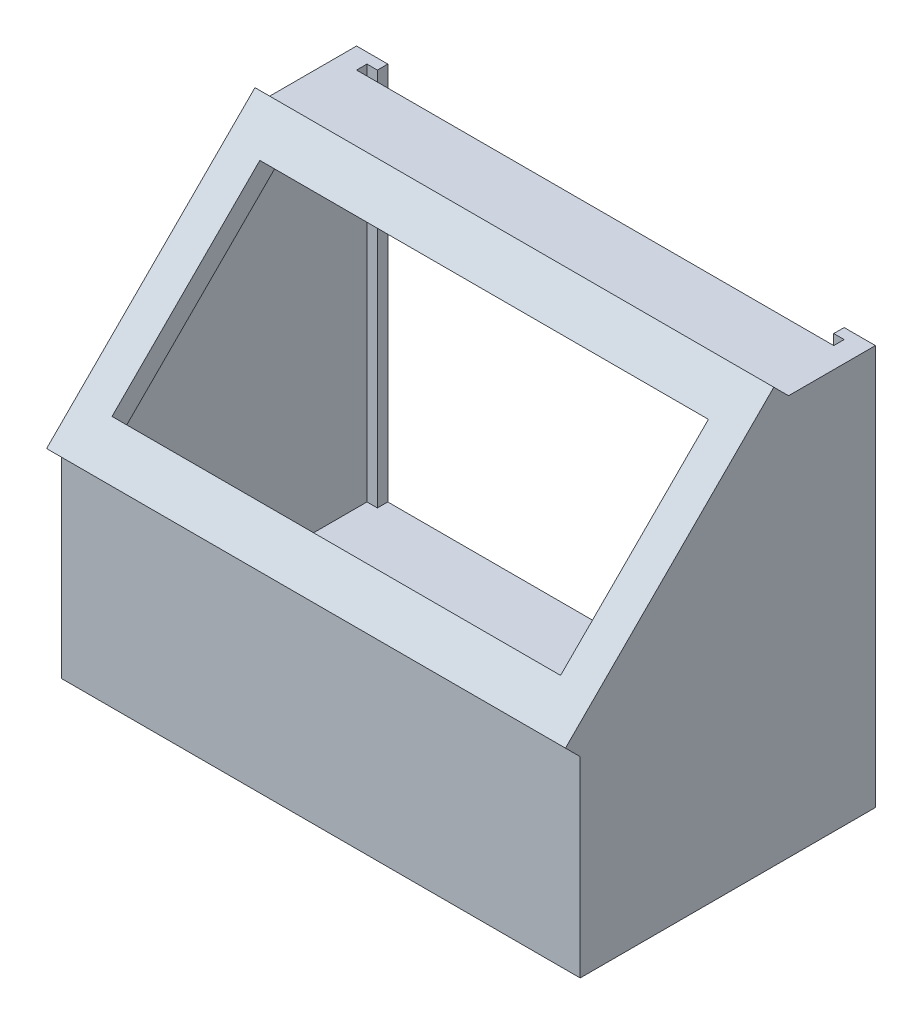
ISO-10303-21;
HEADER;
FILE_DESCRIPTION(('STEP AP214'),'2;1');
FILE_NAME('part.step','',(''),(''),'','','');
FILE_SCHEMA(('AUTOMOTIVE_DESIGN { 1 0 10303 214 1 1 1 1 }'));
ENDSEC;
DATA;
#1=APPLICATION_CONTEXT('core data for automotive mechanical design processes');
#2=APPLICATION_PROTOCOL_DEFINITION('international standard','automotive_design',2000,#1);
#3=PRODUCT_CONTEXT('',#1,'mechanical');
#4=PRODUCT('Part','Part','',(#3));
#5=PRODUCT_RELATED_PRODUCT_CATEGORY('part','',(#4));
#6=PRODUCT_DEFINITION_FORMATION('','',#4);
#7=PRODUCT_DEFINITION_CONTEXT('part definition',#1,'design');
#8=PRODUCT_DEFINITION('design','',#6,#7);
#9=PRODUCT_DEFINITION_SHAPE('','',#8);
#10=(LENGTH_UNIT() NAMED_UNIT(*) SI_UNIT(.MILLI.,.METRE.));
#11=(NAMED_UNIT(*) PLANE_ANGLE_UNIT() SI_UNIT($,.RADIAN.));
#12=(NAMED_UNIT(*) SI_UNIT($,.STERADIAN.) SOLID_ANGLE_UNIT());
#13=UNCERTAINTY_MEASURE_WITH_UNIT(LENGTH_MEASURE(1.E-05),#10,'distance_accuracy_value','');
#14=(GEOMETRIC_REPRESENTATION_CONTEXT(3) GLOBAL_UNCERTAINTY_ASSIGNED_CONTEXT((#13)) GLOBAL_UNIT_ASSIGNED_CONTEXT((#10,
#11,#12)) REPRESENTATION_CONTEXT('',''));
#15=CARTESIAN_POINT('',(0.,0.,0.));
#16=DIRECTION('',(0.,0.,1.));
#17=DIRECTION('',(1.,0.,0.));
#18=AXIS2_PLACEMENT_3D('',#15,#16,#17);
#19=CARTESIAN_POINT('',(-124.501901175312,192.,-65.8387202372985));
#20=DIRECTION('',(0.,0.,1.));
#21=DIRECTION('',(1.,0.,0.));
#22=AXIS2_PLACEMENT_3D('',#19,#20,#21);
#23=PLANE('',#22);
#24=DIRECTION('',(-1.,0.,0.));
#25=VECTOR('',#24,1.);
#26=CARTESIAN_POINT('',(-124.501901175312,182.,-65.8387202372985));
#27=LINE('',#26,#25);
#28=CARTESIAN_POINT('',(114.501901175312,182.,-65.8387202372985));
#29=VERTEX_POINT('',#28);
#30=CARTESIAN_POINT('',(-114.501901175312,182.,-65.8387202372985));
#31=VERTEX_POINT('',#30);
#32=EDGE_CURVE('E304',#29,#31,#27,.T.);
#33=ORIENTED_EDGE('',*,*,#32,.T.);
#34=DIRECTION('',(0.,1.,0.));
#35=VECTOR('',#34,1.);
#36=CARTESIAN_POINT('',(-114.501901175312,0.,-65.8387202372985));
#37=LINE('',#36,#35);
#38=CARTESIAN_POINT('',(-114.501901175312,192.,-65.8387202372985));
#39=VERTEX_POINT('',#38);
#40=EDGE_CURVE('E11',#31,#39,#37,.T.);
#41=ORIENTED_EDGE('',*,*,#40,.T.);
#42=DIRECTION('',(-1.,0.,0.));
#43=VECTOR('',#42,1.);
#44=CARTESIAN_POINT('',(-124.501901175312,192.,-65.8387202372985));
#45=LINE('',#44,#43);
#46=CARTESIAN_POINT('',(114.501901175312,192.,-65.8387202372985));
#47=VERTEX_POINT('',#46);
#48=EDGE_CURVE('E431',#47,#39,#45,.T.);
#49=ORIENTED_EDGE('',*,*,#48,.F.);
#50=DIRECTION('',(0.,1.,0.));
#51=VECTOR('',#50,1.);
#52=CARTESIAN_POINT('',(114.501901175312,0.,-65.8387202372985));
#53=LINE('',#52,#51);
#54=EDGE_CURVE('E53',#29,#47,#53,.T.);
#55=ORIENTED_EDGE('',*,*,#54,.F.);
#56=EDGE_LOOP('',(#33,#41,#49,#55));
#57=FACE_BOUND('',#56,.T.);
#58=ADVANCED_FACE('F43',(#57),#23,.F.);
#59=CARTESIAN_POINT('',(124.501901175312,192.,-65.8387202372985));
#60=DIRECTION('',(-1.,0.,0.));
#61=DIRECTION('',(0.,0.,1.));
#62=AXIS2_PLACEMENT_3D('',#59,#60,#61);
#63=PLANE('',#62);
#64=DIRECTION('',(0.,0.,-1.));
#65=VECTOR('',#64,1.);
#66=CARTESIAN_POINT('',(124.501901175312,192.,-65.8387202372985));
#67=LINE('',#66,#65);
#68=CARTESIAN_POINT('',(124.501901175312,192.,-34.1612797627015));
#69=VERTEX_POINT('',#68);
#70=CARTESIAN_POINT('',(124.501901175312,192.,-75.8387202372985));
#71=VERTEX_POINT('',#70);
#72=EDGE_CURVE('E428',#69,#71,#67,.T.);
#73=ORIENTED_EDGE('',*,*,#72,.F.);
#74=DIRECTION('',(0.,-0.707106781186546,-0.707106781186549));
#75=VECTOR('',#74,1.);
#76=CARTESIAN_POINT('',(124.501901175312,199.071067811866,-27.0902119508361));
#77=LINE('',#76,#75);
#78=CARTESIAN_POINT('',(124.501901175312,199.071067811866,-27.0902119508361));
#79=VERTEX_POINT('',#78);
#80=EDGE_CURVE('E415',#79,#69,#77,.T.);
#81=ORIENTED_EDGE('',*,*,#80,.F.);
#82=DIRECTION('',(0.,0.707106781186549,-0.707106781186546));
#83=VECTOR('',#82,1.);
#84=CARTESIAN_POINT('',(124.501901175312,99.0710678118652,72.909788049164));
#85=LINE('',#84,#83);
#86=CARTESIAN_POINT('',(124.501901175312,99.0710678118652,72.909788049164));
#87=VERTEX_POINT('',#86);
#88=EDGE_CURVE('E412',#87,#79,#85,.T.);
#89=ORIENTED_EDGE('',*,*,#88,.F.);
#90=DIRECTION('',(0.,-0.707106781186546,-0.707106781186549));
#91=VECTOR('',#90,1.);
#92=CARTESIAN_POINT('',(124.501901175312,99.0710678118652,72.909788049164));
#93=LINE('',#92,#91);
#94=CARTESIAN_POINT('',(124.501901175312,91.9999999999997,65.8387202372985));
#95=VERTEX_POINT('',#94);
#96=EDGE_CURVE('E418',#87,#95,#93,.T.);
#97=ORIENTED_EDGE('',*,*,#96,.T.);
#98=DIRECTION('',(0.,-1.,0.));
#99=VECTOR('',#98,1.);
#100=CARTESIAN_POINT('',(124.501901175312,192.,65.8387202372985));
#101=LINE('',#100,#99);
#102=CARTESIAN_POINT('',(124.501901175312,0.,65.8387202372985));
#103=VERTEX_POINT('',#102);
#104=EDGE_CURVE('E439',#95,#103,#101,.T.);
#105=ORIENTED_EDGE('',*,*,#104,.T.);
#106=DIRECTION('',(0.,0.,-1.));
#107=VECTOR('',#106,1.);
#108=CARTESIAN_POINT('',(124.501901175312,0.,-65.8387202372985));
#109=LINE('',#108,#107);
#110=CARTESIAN_POINT('',(124.501901175312,0.,-75.8387202372985));
#111=VERTEX_POINT('',#110);
#112=EDGE_CURVE('E427',#103,#111,#109,.T.);
#113=ORIENTED_EDGE('',*,*,#112,.T.);
#114=DIRECTION('',(0.,-1.,0.));
#115=VECTOR('',#114,1.);
#116=CARTESIAN_POINT('',(124.501901175312,0.,-75.8387202372985));
#117=LINE('',#116,#115);
#118=EDGE_CURVE('E250',#71,#111,#117,.T.);
#119=ORIENTED_EDGE('',*,*,#118,.F.);
#120=EDGE_LOOP('',(#73,#81,#89,#97,#105,#113,#119));
#121=FACE_BOUND('',#120,.T.);
#122=ADVANCED_FACE('F45',(#121),#63,.F.);
#123=CARTESIAN_POINT('',(-124.501901175312,192.,-65.8387202372985));
#124=DIRECTION('',(1.,0.,0.));
#125=DIRECTION('',(0.,0.,-1.));
#126=AXIS2_PLACEMENT_3D('',#123,#124,#125);
#127=PLANE('',#126);
#128=DIRECTION('',(0.,-1.,0.));
#129=VECTOR('',#128,1.);
#130=CARTESIAN_POINT('',(-124.501901175312,192.,65.8387202372985));
#131=LINE('',#130,#129);
#132=CARTESIAN_POINT('',(-124.501901175312,91.9999999999997,65.8387202372985));
#133=VERTEX_POINT('',#132);
#134=CARTESIAN_POINT('',(-124.501901175312,0.,65.8387202372985));
#135=VERTEX_POINT('',#134);
#136=EDGE_CURVE('E451',#133,#135,#131,.T.);
#137=ORIENTED_EDGE('',*,*,#136,.F.);
#138=DIRECTION('',(0.,-0.707106781186546,-0.707106781186549));
#139=VECTOR('',#138,1.);
#140=CARTESIAN_POINT('',(-124.501901175312,99.0710678118652,72.909788049164));
#141=LINE('',#140,#139);
#142=CARTESIAN_POINT('',(-124.501901175312,99.0710678118652,72.909788049164));
#143=VERTEX_POINT('',#142);
#144=EDGE_CURVE('E421',#143,#133,#141,.T.);
#145=ORIENTED_EDGE('',*,*,#144,.F.);
#146=DIRECTION('',(0.,-0.707106781186549,0.707106781186546));
#147=VECTOR('',#146,1.);
#148=CARTESIAN_POINT('',(-124.501901175312,199.071067811866,-27.0902119508361));
#149=LINE('',#148,#147);
#150=CARTESIAN_POINT('',(-124.501901175312,199.071067811866,-27.0902119508361));
#151=VERTEX_POINT('',#150);
#152=EDGE_CURVE('E406',#151,#143,#149,.T.);
#153=ORIENTED_EDGE('',*,*,#152,.F.);
#154=DIRECTION('',(0.,-0.707106781186546,-0.707106781186549));
#155=VECTOR('',#154,1.);
#156=CARTESIAN_POINT('',(-124.501901175312,199.071067811866,-27.0902119508361));
#157=LINE('',#156,#155);
#158=CARTESIAN_POINT('',(-124.501901175312,192.,-34.1612797627015));
#159=VERTEX_POINT('',#158);
#160=EDGE_CURVE('E424',#151,#159,#157,.T.);
#161=ORIENTED_EDGE('',*,*,#160,.T.);
#162=DIRECTION('',(0.,0.,1.));
#163=VECTOR('',#162,1.);
#164=CARTESIAN_POINT('',(-124.501901175312,192.,-65.8387202372985));
#165=LINE('',#164,#163);
#166=CARTESIAN_POINT('',(-124.501901175312,192.,-75.8387202372985));
#167=VERTEX_POINT('',#166);
#168=EDGE_CURVE('E436',#167,#159,#165,.T.);
#169=ORIENTED_EDGE('',*,*,#168,.F.);
#170=DIRECTION('',(0.,1.,0.));
#171=VECTOR('',#170,1.);
#172=CARTESIAN_POINT('',(-124.501901175312,0.,-75.8387202372985));
#173=LINE('',#172,#171);
#174=CARTESIAN_POINT('',(-124.501901175312,0.,-75.8387202372985));
#175=VERTEX_POINT('',#174);
#176=EDGE_CURVE('E217',#175,#167,#173,.T.);
#177=ORIENTED_EDGE('',*,*,#176,.F.);
#178=DIRECTION('',(0.,0.,1.));
#179=VECTOR('',#178,1.);
#180=CARTESIAN_POINT('',(-124.501901175312,0.,-65.8387202372985));
#181=LINE('',#180,#179);
#182=EDGE_CURVE('E442',#175,#135,#181,.T.);
#183=ORIENTED_EDGE('',*,*,#182,.T.);
#184=EDGE_LOOP('',(#137,#145,#153,#161,#169,#177,#183));
#185=FACE_BOUND('',#184,.T.);
#186=ADVANCED_FACE('F469',(#185),#127,.F.);
#187=CARTESIAN_POINT('',(-124.501901175312,192.,65.8387202372985));
#188=DIRECTION('',(0.,0.,-1.));
#189=DIRECTION('',(-1.,0.,0.));
#190=AXIS2_PLACEMENT_3D('',#187,#188,#189);
#191=PLANE('',#190);
#192=ORIENTED_EDGE('',*,*,#104,.F.);
#193=DIRECTION('',(-1.,0.,0.));
#194=VECTOR('',#193,1.);
#195=CARTESIAN_POINT('',(-124.501901175312,91.9999999999997,65.8387202372985));
#196=LINE('',#195,#194);
#197=EDGE_CURVE('E47',#95,#133,#196,.T.);
#198=ORIENTED_EDGE('',*,*,#197,.T.);
#199=ORIENTED_EDGE('',*,*,#136,.T.);
#200=DIRECTION('',(1.,0.,0.));
#201=VECTOR('',#200,1.);
#202=CARTESIAN_POINT('',(-124.501901175312,0.,65.8387202372985));
#203=LINE('',#202,#201);
#204=EDGE_CURVE('E432',#135,#103,#203,.T.);
#205=ORIENTED_EDGE('',*,*,#204,.T.);
#206=EDGE_LOOP('',(#192,#198,#199,#205));
#207=FACE_BOUND('',#206,.T.);
#208=ADVANCED_FACE('F464',(#207),#191,.F.);
#209=CARTESIAN_POINT('',(0.,192.,0.));
#210=DIRECTION('',(0.,1.,0.));
#211=DIRECTION('',(0.,0.,1.));
#212=AXIS2_PLACEMENT_3D('',#209,#210,#211);
#213=PLANE('',#212);
#214=ORIENTED_EDGE('',*,*,#168,.T.);
#215=DIRECTION('',(1.,0.,0.));
#216=VECTOR('',#215,1.);
#217=CARTESIAN_POINT('',(124.501901175312,192.,-34.1612797627015));
#218=LINE('',#217,#216);
#219=EDGE_CURVE('E453',#159,#69,#218,.T.);
#220=ORIENTED_EDGE('',*,*,#219,.T.);
#221=ORIENTED_EDGE('',*,*,#72,.T.);
#222=DIRECTION('',(1.,0.,0.));
#223=VECTOR('',#222,1.);
#224=CARTESIAN_POINT('',(0.,192.,-75.8387202372985));
#225=LINE('',#224,#223);
#226=CARTESIAN_POINT('',(109.501901175312,192.,-75.8387202372985));
#227=VERTEX_POINT('',#226);
#228=EDGE_CURVE('E246',#227,#71,#225,.T.);
#229=ORIENTED_EDGE('',*,*,#228,.F.);
#230=DIRECTION('',(0.,0.,1.));
#231=VECTOR('',#230,1.);
#232=CARTESIAN_POINT('',(109.501901175312,192.,-75.8387202372985));
#233=LINE('',#232,#231);
#234=CARTESIAN_POINT('',(109.501901175312,192.,-70.8387202372985));
#235=VERTEX_POINT('',#234);
#236=EDGE_CURVE('E259',#227,#235,#233,.T.);
#237=ORIENTED_EDGE('',*,*,#236,.T.);
#238=DIRECTION('',(1.,0.,0.));
#239=VECTOR('',#238,1.);
#240=CARTESIAN_POINT('',(0.,192.,-70.8387202372985));
#241=LINE('',#240,#239);
#242=CARTESIAN_POINT('',(114.501901175312,192.,-70.8387202372985));
#243=VERTEX_POINT('',#242);
#244=EDGE_CURVE('E221',#235,#243,#241,.T.);
#245=ORIENTED_EDGE('',*,*,#244,.T.);
#246=DIRECTION('',(0.,0.,1.));
#247=VECTOR('',#246,1.);
#248=CARTESIAN_POINT('',(114.501901175312,192.,-70.8387202372985));
#249=LINE('',#248,#247);
#250=EDGE_CURVE('E295',#243,#47,#249,.T.);
#251=ORIENTED_EDGE('',*,*,#250,.T.);
#252=ORIENTED_EDGE('',*,*,#48,.T.);
#253=DIRECTION('',(0.,0.,1.));
#254=VECTOR('',#253,1.);
#255=CARTESIAN_POINT('',(-114.501901175312,192.,-70.8387202372985));
#256=LINE('',#255,#254);
#257=CARTESIAN_POINT('',(-114.501901175312,192.,-70.8387202372985));
#258=VERTEX_POINT('',#257);
#259=EDGE_CURVE('E287',#258,#39,#256,.T.);
#260=ORIENTED_EDGE('',*,*,#259,.F.);
#261=DIRECTION('',(1.,0.,0.));
#262=VECTOR('',#261,1.);
#263=CARTESIAN_POINT('',(0.,192.,-70.8387202372985));
#264=LINE('',#263,#262);
#265=CARTESIAN_POINT('',(-109.501901175312,192.,-70.8387202372985));
#266=VERTEX_POINT('',#265);
#267=EDGE_CURVE('E227',#258,#266,#264,.T.);
#268=ORIENTED_EDGE('',*,*,#267,.T.);
#269=DIRECTION('',(0.,0.,1.));
#270=VECTOR('',#269,1.);
#271=CARTESIAN_POINT('',(-109.501901175312,192.,-75.8387202372985));
#272=LINE('',#271,#270);
#273=CARTESIAN_POINT('',(-109.501901175312,192.,-75.8387202372985));
#274=VERTEX_POINT('',#273);
#275=EDGE_CURVE('E224',#274,#266,#272,.T.);
#276=ORIENTED_EDGE('',*,*,#275,.F.);
#277=DIRECTION('',(1.,0.,0.));
#278=VECTOR('',#277,1.);
#279=CARTESIAN_POINT('',(0.,192.,-75.8387202372985));
#280=LINE('',#279,#278);
#281=EDGE_CURVE('E210',#167,#274,#280,.T.);
#282=ORIENTED_EDGE('',*,*,#281,.F.);
#283=EDGE_LOOP('',(#214,#220,#221,#229,#237,#245,#251,#252,#260,#268,#276,#282));
#284=FACE_BOUND('',#283,.T.);
#285=ADVANCED_FACE('F225',(#284),#213,.T.);
#286=CARTESIAN_POINT('',(0.,0.,0.));
#287=DIRECTION('',(0.,1.,0.));
#288=DIRECTION('',(0.,0.,1.));
#289=AXIS2_PLACEMENT_3D('',#286,#287,#288);
#290=PLANE('',#289);
#291=ORIENTED_EDGE('',*,*,#112,.F.);
#292=ORIENTED_EDGE('',*,*,#204,.F.);
#293=ORIENTED_EDGE('',*,*,#182,.F.);
#294=DIRECTION('',(-1.,0.,0.));
#295=VECTOR('',#294,1.);
#296=CARTESIAN_POINT('',(0.,0.,-75.8387202372985));
#297=LINE('',#296,#295);
#298=EDGE_CURVE('E254',#111,#175,#297,.T.);
#299=ORIENTED_EDGE('',*,*,#298,.F.);
#300=EDGE_LOOP('',(#291,#292,#293,#299));
#301=FACE_BOUND('',#300,.T.);
#302=ADVANCED_FACE('F475',(#301),#290,.F.);
#303=CARTESIAN_POINT('',(0.,85.9904279305144,85.9904279305147));
#304=DIRECTION('',(0.,0.707106781186546,0.707106781186549));
#305=DIRECTION('',(0.,-0.707106781186549,0.707106781186546));
#306=AXIS2_PLACEMENT_3D('',#303,#304,#305);
#307=PLANE('',#306);
#308=DIRECTION('',(-1.,0.,0.));
#309=VECTOR('',#308,1.);
#310=CARTESIAN_POINT('',(124.501901175312,199.071067811866,-27.0902119508361));
#311=LINE('',#310,#309);
#312=EDGE_CURVE('E402',#79,#151,#311,.T.);
#313=ORIENTED_EDGE('',*,*,#312,.T.);
#314=ORIENTED_EDGE('',*,*,#152,.T.);
#315=DIRECTION('',(1.,0.,0.));
#316=VECTOR('',#315,1.);
#317=CARTESIAN_POINT('',(-124.501901175312,99.0710678118652,72.909788049164));
#318=LINE('',#317,#316);
#319=EDGE_CURVE('E409',#143,#87,#318,.T.);
#320=ORIENTED_EDGE('',*,*,#319,.T.);
#321=ORIENTED_EDGE('',*,*,#88,.T.);
#322=EDGE_LOOP('',(#313,#314,#320,#321));
#323=FACE_BOUND('',#322,.T.);
#324=DIRECTION('',(-1.,0.,0.));
#325=VECTOR('',#324,1.);
#326=CARTESIAN_POINT('',(-107.630286129629,184.542842785867,-12.5619869248373));
#327=LINE('',#326,#325);
#328=CARTESIAN_POINT('',(107.630286129629,184.542842785867,-12.5619869248373));
#329=VERTEX_POINT('',#328);
#330=CARTESIAN_POINT('',(-107.630286129629,184.542842785867,-12.5619869248373));
#331=VERTEX_POINT('',#330);
#332=EDGE_CURVE('E365',#329,#331,#327,.T.);
#333=ORIENTED_EDGE('',*,*,#332,.F.);
#334=DIRECTION('',(0.,0.707106781186549,-0.707106781186546));
#335=VECTOR('',#334,1.);
#336=CARTESIAN_POINT('',(107.630286129629,184.542842785867,-12.5619869248373));
#337=LINE('',#336,#335);
#338=CARTESIAN_POINT('',(107.630286129629,113.599292837864,58.3815630231653));
#339=VERTEX_POINT('',#338);
#340=EDGE_CURVE('E362',#339,#329,#337,.T.);
#341=ORIENTED_EDGE('',*,*,#340,.F.);
#342=DIRECTION('',(1.,0.,0.));
#343=VECTOR('',#342,1.);
#344=CARTESIAN_POINT('',(-107.630286129629,113.599292837864,58.3815630231653));
#345=LINE('',#344,#343);
#346=CARTESIAN_POINT('',(-107.630286129629,113.599292837864,58.3815630231653));
#347=VERTEX_POINT('',#346);
#348=EDGE_CURVE('E373',#347,#339,#345,.T.);
#349=ORIENTED_EDGE('',*,*,#348,.F.);
#350=DIRECTION('',(0.,-0.707106781186549,0.707106781186546));
#351=VECTOR('',#350,1.);
#352=CARTESIAN_POINT('',(-107.630286129629,184.542842785867,-12.5619869248373));
#353=LINE('',#352,#351);
#354=EDGE_CURVE('E369',#331,#347,#353,.T.);
#355=ORIENTED_EDGE('',*,*,#354,.F.);
#356=EDGE_LOOP('',(#333,#341,#349,#355));
#357=FACE_BOUND('',#356,.T.);
#358=ADVANCED_FACE('F488',(#323,#357),#307,.T.);
#359=CARTESIAN_POINT('',(124.501901175312,199.071067811866,-27.0902119508361));
#360=DIRECTION('',(0.,-0.707106781186549,0.707106781186546));
#361=DIRECTION('',(0.,-0.707106781186546,-0.707106781186549));
#362=AXIS2_PLACEMENT_3D('',#359,#360,#361);
#363=PLANE('',#362);
#364=ORIENTED_EDGE('',*,*,#219,.F.);
#365=ORIENTED_EDGE('',*,*,#160,.F.);
#366=ORIENTED_EDGE('',*,*,#312,.F.);
#367=ORIENTED_EDGE('',*,*,#80,.T.);
#368=EDGE_LOOP('',(#364,#365,#366,#367));
#369=FACE_BOUND('',#368,.T.);
#370=ADVANCED_FACE('F486',(#369),#363,.F.);
#371=CARTESIAN_POINT('',(-124.501901175312,99.0710678118652,72.909788049164));
#372=DIRECTION('',(0.,0.707106781186549,-0.707106781186546));
#373=DIRECTION('',(0.,0.707106781186546,0.707106781186549));
#374=AXIS2_PLACEMENT_3D('',#371,#372,#373);
#375=PLANE('',#374);
#376=ORIENTED_EDGE('',*,*,#197,.F.);
#377=ORIENTED_EDGE('',*,*,#96,.F.);
#378=ORIENTED_EDGE('',*,*,#319,.F.);
#379=ORIENTED_EDGE('',*,*,#144,.T.);
#380=EDGE_LOOP('',(#376,#377,#378,#379));
#381=FACE_BOUND('',#380,.T.);
#382=ADVANCED_FACE('F490',(#381),#375,.F.);
#383=CARTESIAN_POINT('',(107.630286129629,184.542842785867,-12.5619869248373));
#384=DIRECTION('',(-1.,0.,0.));
#385=DIRECTION('',(0.,0.,1.));
#386=AXIS2_PLACEMENT_3D('',#383,#384,#385);
#387=PLANE('',#386);
#388=DIRECTION('',(0.,0.707106781186549,-0.707106781186546));
#389=VECTOR('',#388,1.);
#390=CARTESIAN_POINT('',(107.630286129629,177.471774974001,-19.6330547367028));
#391=LINE('',#390,#389);
#392=CARTESIAN_POINT('',(107.630286129629,106.528225025998,51.3104952112998));
#393=VERTEX_POINT('',#392);
#394=CARTESIAN_POINT('',(107.630286129629,177.471774974001,-19.6330547367028));
#395=VERTEX_POINT('',#394);
#396=EDGE_CURVE('E331',#393,#395,#391,.T.);
#397=ORIENTED_EDGE('',*,*,#396,.F.);
#398=DIRECTION('',(0.,-0.707106781186546,-0.707106781186549));
#399=VECTOR('',#398,1.);
#400=CARTESIAN_POINT('',(107.630286129629,113.599292837864,58.3815630231653));
#401=LINE('',#400,#399);
#402=EDGE_CURVE('E376',#339,#393,#401,.T.);
#403=ORIENTED_EDGE('',*,*,#402,.F.);
#404=ORIENTED_EDGE('',*,*,#340,.T.);
#405=DIRECTION('',(0.,-0.707106781186546,-0.707106781186549));
#406=VECTOR('',#405,1.);
#407=CARTESIAN_POINT('',(107.630286129629,184.542842785867,-12.5619869248373));
#408=LINE('',#407,#406);
#409=EDGE_CURVE('E398',#329,#395,#408,.T.);
#410=ORIENTED_EDGE('',*,*,#409,.T.);
#411=EDGE_LOOP('',(#397,#403,#404,#410));
#412=FACE_BOUND('',#411,.T.);
#413=ADVANCED_FACE('F492',(#412),#387,.T.);
#414=CARTESIAN_POINT('',(-107.630286129629,184.542842785867,-12.5619869248373));
#415=DIRECTION('',(0.,-0.707106781186549,0.707106781186546));
#416=DIRECTION('',(0.,-0.707106781186546,-0.707106781186549));
#417=AXIS2_PLACEMENT_3D('',#414,#415,#416);
#418=PLANE('',#417);
#419=DIRECTION('',(-1.,0.,0.));
#420=VECTOR('',#419,1.);
#421=CARTESIAN_POINT('',(-107.630286129629,177.471774974001,-19.6330547367028));
#422=LINE('',#421,#420);
#423=CARTESIAN_POINT('',(-107.630286129629,177.471774974001,-19.6330547367028));
#424=VERTEX_POINT('',#423);
#425=EDGE_CURVE('E379',#395,#424,#422,.T.);
#426=ORIENTED_EDGE('',*,*,#425,.F.);
#427=ORIENTED_EDGE('',*,*,#409,.F.);
#428=ORIENTED_EDGE('',*,*,#332,.T.);
#429=DIRECTION('',(0.,-0.707106781186546,-0.707106781186549));
#430=VECTOR('',#429,1.);
#431=CARTESIAN_POINT('',(-107.630286129629,184.542842785867,-12.5619869248373));
#432=LINE('',#431,#430);
#433=EDGE_CURVE('E394',#331,#424,#432,.T.);
#434=ORIENTED_EDGE('',*,*,#433,.T.);
#435=EDGE_LOOP('',(#426,#427,#428,#434));
#436=FACE_BOUND('',#435,.T.);
#437=ADVANCED_FACE('F498',(#436),#418,.T.);
#438=CARTESIAN_POINT('',(-107.630286129629,184.542842785867,-12.5619869248373));
#439=DIRECTION('',(1.,0.,0.));
#440=DIRECTION('',(0.,0.,-1.));
#441=AXIS2_PLACEMENT_3D('',#438,#439,#440);
#442=PLANE('',#441);
#443=DIRECTION('',(0.,-0.707106781186549,0.707106781186546));
#444=VECTOR('',#443,1.);
#445=CARTESIAN_POINT('',(-107.630286129629,177.471774974001,-19.6330547367028));
#446=LINE('',#445,#444);
#447=CARTESIAN_POINT('',(-107.630286129629,106.528225025998,51.3104952112998));
#448=VERTEX_POINT('',#447);
#449=EDGE_CURVE('E382',#424,#448,#446,.T.);
#450=ORIENTED_EDGE('',*,*,#449,.F.);
#451=ORIENTED_EDGE('',*,*,#433,.F.);
#452=ORIENTED_EDGE('',*,*,#354,.T.);
#453=DIRECTION('',(0.,-0.707106781186546,-0.707106781186549));
#454=VECTOR('',#453,1.);
#455=CARTESIAN_POINT('',(-107.630286129629,113.599292837864,58.3815630231653));
#456=LINE('',#455,#454);
#457=EDGE_CURVE('E390',#347,#448,#456,.T.);
#458=ORIENTED_EDGE('',*,*,#457,.T.);
#459=EDGE_LOOP('',(#450,#451,#452,#458));
#460=FACE_BOUND('',#459,.T.);
#461=ADVANCED_FACE('F790',(#460),#442,.T.);
#462=CARTESIAN_POINT('',(-107.630286129629,113.599292837864,58.3815630231653));
#463=DIRECTION('',(0.,0.707106781186549,-0.707106781186546));
#464=DIRECTION('',(0.,0.707106781186546,0.707106781186549));
#465=AXIS2_PLACEMENT_3D('',#462,#463,#464);
#466=PLANE('',#465);
#467=DIRECTION('',(1.,0.,0.));
#468=VECTOR('',#467,1.);
#469=CARTESIAN_POINT('',(-107.630286129629,106.528225025998,51.3104952112998));
#470=LINE('',#469,#468);
#471=EDGE_CURVE('E366',#448,#393,#470,.T.);
#472=ORIENTED_EDGE('',*,*,#471,.F.);
#473=ORIENTED_EDGE('',*,*,#457,.F.);
#474=ORIENTED_EDGE('',*,*,#348,.T.);
#475=ORIENTED_EDGE('',*,*,#402,.T.);
#476=EDGE_LOOP('',(#472,#473,#474,#475));
#477=FACE_BOUND('',#476,.T.);
#478=ADVANCED_FACE('F534',(#477),#466,.T.);
#479=CARTESIAN_POINT('',(114.501901175312,192.,-65.8387202372985));
#480=DIRECTION('',(-1.,0.,0.));
#481=DIRECTION('',(0.,0.,1.));
#482=AXIS2_PLACEMENT_3D('',#479,#480,#481);
#483=PLANE('',#482);
#484=DIRECTION('',(0.,0.,-1.));
#485=VECTOR('',#484,1.);
#486=CARTESIAN_POINT('',(114.501901175312,182.,-65.8387202372985));
#487=LINE('',#486,#485);
#488=CARTESIAN_POINT('',(114.501901175312,182.,-30.0191441389706));
#489=VERTEX_POINT('',#488);
#490=EDGE_CURVE('E300',#489,#29,#487,.T.);
#491=ORIENTED_EDGE('',*,*,#490,.T.);
#492=ORIENTED_EDGE('',*,*,#54,.T.);
#493=ORIENTED_EDGE('',*,*,#250,.F.);
#494=DIRECTION('',(0.,1.,0.));
#495=VECTOR('',#494,1.);
#496=CARTESIAN_POINT('',(114.501901175312,0.,-70.8387202372985));
#497=LINE('',#496,#495);
#498=CARTESIAN_POINT('',(114.501901175312,10.,-70.8387202372985));
#499=VERTEX_POINT('',#498);
#500=EDGE_CURVE('E284',#499,#243,#497,.T.);
#501=ORIENTED_EDGE('',*,*,#500,.F.);
#502=DIRECTION('',(0.,0.,-1.));
#503=VECTOR('',#502,1.);
#504=CARTESIAN_POINT('',(114.501901175312,10.,-65.8387202372985));
#505=LINE('',#504,#503);
#506=CARTESIAN_POINT('',(114.501901175312,10.,55.8387202372985));
#507=VERTEX_POINT('',#506);
#508=EDGE_CURVE('E322',#507,#499,#505,.T.);
#509=ORIENTED_EDGE('',*,*,#508,.F.);
#510=DIRECTION('',(0.,-1.,0.));
#511=VECTOR('',#510,1.);
#512=CARTESIAN_POINT('',(114.501901175312,192.,55.8387202372985));
#513=LINE('',#512,#511);
#514=CARTESIAN_POINT('',(114.501901175312,96.1421356237307,55.8387202372985));
#515=VERTEX_POINT('',#514);
#516=EDGE_CURVE('E317',#515,#507,#513,.T.);
#517=ORIENTED_EDGE('',*,*,#516,.F.);
#518=DIRECTION('',(0.,-0.707106781186546,-0.707106781186549));
#519=VECTOR('',#518,1.);
#520=CARTESIAN_POINT('',(114.501901175312,83.2323475745668,42.9289321881345));
#521=LINE('',#520,#519);
#522=CARTESIAN_POINT('',(114.501901175312,99.0710678118652,58.767652425433));
#523=VERTEX_POINT('',#522);
#524=EDGE_CURVE('E309',#523,#515,#521,.T.);
#525=ORIENTED_EDGE('',*,*,#524,.F.);
#526=DIRECTION('',(0.,0.707106781186549,-0.707106781186546));
#527=VECTOR('',#526,1.);
#528=CARTESIAN_POINT('',(114.501901175312,207.838720237299,-50.));
#529=LINE('',#528,#527);
#530=CARTESIAN_POINT('',(114.501901175312,184.928932188135,-27.0902119508361));
#531=VERTEX_POINT('',#530);
#532=EDGE_CURVE('E310',#523,#531,#529,.T.);
#533=ORIENTED_EDGE('',*,*,#532,.T.);
#534=DIRECTION('',(0.,-0.707106781186546,-0.707106781186549));
#535=VECTOR('',#534,1.);
#536=CARTESIAN_POINT('',(114.501901175312,192.,-20.0191441389706));
#537=LINE('',#536,#535);
#538=EDGE_CURVE('E306',#531,#489,#537,.T.);
#539=ORIENTED_EDGE('',*,*,#538,.T.);
#540=EDGE_LOOP('',(#491,#492,#493,#501,#509,#517,#525,#533,#539));
#541=FACE_BOUND('',#540,.T.);
#542=ADVANCED_FACE('F530',(#541),#483,.T.);
#543=CARTESIAN_POINT('',(-114.501901175312,192.,-65.8387202372985));
#544=DIRECTION('',(1.,0.,0.));
#545=DIRECTION('',(0.,0.,-1.));
#546=AXIS2_PLACEMENT_3D('',#543,#544,#545);
#547=PLANE('',#546);
#548=DIRECTION('',(0.,-1.,0.));
#549=VECTOR('',#548,1.);
#550=CARTESIAN_POINT('',(-114.501901175312,192.,55.8387202372985));
#551=LINE('',#550,#549);
#552=CARTESIAN_POINT('',(-114.501901175312,96.1421356237307,55.8387202372985));
#553=VERTEX_POINT('',#552);
#554=CARTESIAN_POINT('',(-114.501901175312,10.,55.8387202372985));
#555=VERTEX_POINT('',#554);
#556=EDGE_CURVE('E320',#553,#555,#551,.T.);
#557=ORIENTED_EDGE('',*,*,#556,.T.);
#558=DIRECTION('',(0.,0.,1.));
#559=VECTOR('',#558,1.);
#560=CARTESIAN_POINT('',(-114.501901175312,10.,-65.8387202372985));
#561=LINE('',#560,#559);
#562=CARTESIAN_POINT('',(-114.501901175312,10.,-70.8387202372985));
#563=VERTEX_POINT('',#562);
#564=EDGE_CURVE('E325',#563,#555,#561,.T.);
#565=ORIENTED_EDGE('',*,*,#564,.F.);
#566=DIRECTION('',(0.,1.,0.));
#567=VECTOR('',#566,1.);
#568=CARTESIAN_POINT('',(-114.501901175312,0.,-70.8387202372985));
#569=LINE('',#568,#567);
#570=EDGE_CURVE('E231',#563,#258,#569,.T.);
#571=ORIENTED_EDGE('',*,*,#570,.T.);
#572=ORIENTED_EDGE('',*,*,#259,.T.);
#573=ORIENTED_EDGE('',*,*,#40,.F.);
#574=DIRECTION('',(0.,0.,1.));
#575=VECTOR('',#574,1.);
#576=CARTESIAN_POINT('',(-114.501901175312,182.,-65.8387202372985));
#577=LINE('',#576,#575);
#578=CARTESIAN_POINT('',(-114.501901175312,182.,-30.0191441389706));
#579=VERTEX_POINT('',#578);
#580=EDGE_CURVE('E321',#31,#579,#577,.T.);
#581=ORIENTED_EDGE('',*,*,#580,.T.);
#582=DIRECTION('',(0.,-0.707106781186546,-0.707106781186549));
#583=VECTOR('',#582,1.);
#584=CARTESIAN_POINT('',(-114.501901175312,169.090211950836,-42.9289321881346));
#585=LINE('',#584,#583);
#586=CARTESIAN_POINT('',(-114.501901175312,184.928932188135,-27.0902119508361));
#587=VERTEX_POINT('',#586);
#588=EDGE_CURVE('E326',#587,#579,#585,.T.);
#589=ORIENTED_EDGE('',*,*,#588,.F.);
#590=DIRECTION('',(0.,-0.707106781186549,0.707106781186546));
#591=VECTOR('',#590,1.);
#592=CARTESIAN_POINT('',(-114.501901175312,207.838720237299,-50.));
#593=LINE('',#592,#591);
#594=CARTESIAN_POINT('',(-114.501901175312,99.0710678118652,58.767652425433));
#595=VERTEX_POINT('',#594);
#596=EDGE_CURVE('E340',#587,#595,#593,.T.);
#597=ORIENTED_EDGE('',*,*,#596,.T.);
#598=DIRECTION('',(0.,-0.707106781186546,-0.707106781186549));
#599=VECTOR('',#598,1.);
#600=CARTESIAN_POINT('',(-114.501901175312,106.142135623731,65.8387202372985));
#601=LINE('',#600,#599);
#602=EDGE_CURVE('E316',#595,#553,#601,.T.);
#603=ORIENTED_EDGE('',*,*,#602,.T.);
#604=EDGE_LOOP('',(#557,#565,#571,#572,#573,#581,#589,#597,#603));
#605=FACE_BOUND('',#604,.T.);
#606=ADVANCED_FACE('F533',(#605),#547,.T.);
#607=CARTESIAN_POINT('',(-124.501901175312,192.,55.8387202372985));
#608=DIRECTION('',(0.,0.,-1.));
#609=DIRECTION('',(-1.,0.,0.));
#610=AXIS2_PLACEMENT_3D('',#607,#608,#609);
#611=PLANE('',#610);
#612=ORIENTED_EDGE('',*,*,#516,.T.);
#613=DIRECTION('',(1.,0.,0.));
#614=VECTOR('',#613,1.);
#615=CARTESIAN_POINT('',(-124.501901175312,10.,55.8387202372985));
#616=LINE('',#615,#614);
#617=EDGE_CURVE('E305',#555,#507,#616,.T.);
#618=ORIENTED_EDGE('',*,*,#617,.F.);
#619=ORIENTED_EDGE('',*,*,#556,.F.);
#620=DIRECTION('',(-1.,0.,0.));
#621=VECTOR('',#620,1.);
#622=CARTESIAN_POINT('',(-124.501901175312,96.1421356237307,55.8387202372985));
#623=LINE('',#622,#621);
#624=EDGE_CURVE('E327',#515,#553,#623,.T.);
#625=ORIENTED_EDGE('',*,*,#624,.F.);
#626=EDGE_LOOP('',(#612,#618,#619,#625));
#627=FACE_BOUND('',#626,.T.);
#628=ADVANCED_FACE('F542',(#627),#611,.T.);
#629=CARTESIAN_POINT('',(0.,182.,0.));
#630=DIRECTION('',(0.,1.,0.));
#631=DIRECTION('',(0.,0.,1.));
#632=AXIS2_PLACEMENT_3D('',#629,#630,#631);
#633=PLANE('',#632);
#634=ORIENTED_EDGE('',*,*,#580,.F.);
#635=ORIENTED_EDGE('',*,*,#32,.F.);
#636=ORIENTED_EDGE('',*,*,#490,.F.);
#637=DIRECTION('',(1.,0.,0.));
#638=VECTOR('',#637,1.);
#639=CARTESIAN_POINT('',(0.,182.,-30.0191441389706));
#640=LINE('',#639,#638);
#641=EDGE_CURVE('E332',#579,#489,#640,.T.);
#642=ORIENTED_EDGE('',*,*,#641,.F.);
#643=EDGE_LOOP('',(#634,#635,#636,#642));
#644=FACE_BOUND('',#643,.T.);
#645=ADVANCED_FACE('F552',(#644),#633,.F.);
#646=CARTESIAN_POINT('',(0.,10.,0.));
#647=DIRECTION('',(0.,1.,0.));
#648=DIRECTION('',(0.,0.,1.));
#649=AXIS2_PLACEMENT_3D('',#646,#647,#648);
#650=PLANE('',#649);
#651=ORIENTED_EDGE('',*,*,#508,.T.);
#652=DIRECTION('',(1.,0.,0.));
#653=VECTOR('',#652,1.);
#654=CARTESIAN_POINT('',(0.,10.,-70.8387202372985));
#655=LINE('',#654,#653);
#656=CARTESIAN_POINT('',(109.501901175312,10.,-70.8387202372985));
#657=VERTEX_POINT('',#656);
#658=EDGE_CURVE('E61',#657,#499,#655,.T.);
#659=ORIENTED_EDGE('',*,*,#658,.F.);
#660=DIRECTION('',(0.,0.,1.));
#661=VECTOR('',#660,1.);
#662=CARTESIAN_POINT('',(109.501901175312,10.,-75.8387202372985));
#663=LINE('',#662,#661);
#664=CARTESIAN_POINT('',(109.501901175312,10.,-75.8387202372985));
#665=VERTEX_POINT('',#664);
#666=EDGE_CURVE('E274',#665,#657,#663,.T.);
#667=ORIENTED_EDGE('',*,*,#666,.F.);
#668=DIRECTION('',(1.,0.,0.));
#669=VECTOR('',#668,1.);
#670=CARTESIAN_POINT('',(0.,10.,-75.8387202372985));
#671=LINE('',#670,#669);
#672=CARTESIAN_POINT('',(-109.501901175312,10.,-75.8387202372985));
#673=VERTEX_POINT('',#672);
#674=EDGE_CURVE('E237',#673,#665,#671,.T.);
#675=ORIENTED_EDGE('',*,*,#674,.F.);
#676=DIRECTION('',(0.,0.,1.));
#677=VECTOR('',#676,1.);
#678=CARTESIAN_POINT('',(-109.501901175312,10.,-75.8387202372985));
#679=LINE('',#678,#677);
#680=CARTESIAN_POINT('',(-109.501901175312,10.,-70.8387202372985));
#681=VERTEX_POINT('',#680);
#682=EDGE_CURVE('E232',#673,#681,#679,.T.);
#683=ORIENTED_EDGE('',*,*,#682,.T.);
#684=EDGE_CURVE('E69',#563,#681,#655,.T.);
#685=ORIENTED_EDGE('',*,*,#684,.F.);
#686=ORIENTED_EDGE('',*,*,#564,.T.);
#687=ORIENTED_EDGE('',*,*,#617,.T.);
#688=EDGE_LOOP('',(#651,#659,#667,#675,#683,#685,#686,#687));
#689=FACE_BOUND('',#688,.T.);
#690=ADVANCED_FACE('F548',(#689),#650,.T.);
#691=CARTESIAN_POINT('',(124.501901175312,192.,-20.0191441389706));
#692=DIRECTION('',(0.,-0.707106781186549,0.707106781186546));
#693=DIRECTION('',(0.,-0.707106781186546,-0.707106781186549));
#694=AXIS2_PLACEMENT_3D('',#691,#692,#693);
#695=PLANE('',#694);
#696=ORIENTED_EDGE('',*,*,#641,.T.);
#697=ORIENTED_EDGE('',*,*,#538,.F.);
#698=DIRECTION('',(-1.,0.,0.));
#699=VECTOR('',#698,1.);
#700=CARTESIAN_POINT('',(124.501901175312,184.928932188135,-27.0902119508361));
#701=LINE('',#700,#699);
#702=EDGE_CURVE('E299',#531,#587,#701,.T.);
#703=ORIENTED_EDGE('',*,*,#702,.T.);
#704=ORIENTED_EDGE('',*,*,#588,.T.);
#705=EDGE_LOOP('',(#696,#697,#703,#704));
#706=FACE_BOUND('',#705,.T.);
#707=ADVANCED_FACE('F551',(#706),#695,.T.);
#708=CARTESIAN_POINT('',(-124.501901175312,106.142135623731,65.8387202372985));
#709=DIRECTION('',(0.,0.707106781186549,-0.707106781186546));
#710=DIRECTION('',(0.,0.707106781186546,0.707106781186549));
#711=AXIS2_PLACEMENT_3D('',#708,#709,#710);
#712=PLANE('',#711);
#713=ORIENTED_EDGE('',*,*,#624,.T.);
#714=ORIENTED_EDGE('',*,*,#602,.F.);
#715=DIRECTION('',(1.,0.,0.));
#716=VECTOR('',#715,1.);
#717=CARTESIAN_POINT('',(-124.501901175312,99.0710678118652,58.767652425433));
#718=LINE('',#717,#716);
#719=EDGE_CURVE('E313',#595,#523,#718,.T.);
#720=ORIENTED_EDGE('',*,*,#719,.T.);
#721=ORIENTED_EDGE('',*,*,#524,.T.);
#722=EDGE_LOOP('',(#713,#714,#720,#721));
#723=FACE_BOUND('',#722,.T.);
#724=ADVANCED_FACE('F694',(#723),#712,.T.);
#725=CARTESIAN_POINT('',(0.,192.,-34.1612797627015));
#726=DIRECTION('',(0.,0.707106781186546,0.707106781186549));
#727=DIRECTION('',(-1.,0.,0.));
#728=AXIS2_PLACEMENT_3D('',#725,#726,#727);
#729=PLANE('',#728);
#730=ORIENTED_EDGE('',*,*,#396,.T.);
#731=ORIENTED_EDGE('',*,*,#425,.T.);
#732=ORIENTED_EDGE('',*,*,#449,.T.);
#733=ORIENTED_EDGE('',*,*,#471,.T.);
#734=EDGE_LOOP('',(#730,#731,#732,#733));
#735=FACE_BOUND('',#734,.T.);
#736=ORIENTED_EDGE('',*,*,#596,.F.);
#737=ORIENTED_EDGE('',*,*,#702,.F.);
#738=ORIENTED_EDGE('',*,*,#532,.F.);
#739=ORIENTED_EDGE('',*,*,#719,.F.);
#740=EDGE_LOOP('',(#736,#737,#738,#739));
#741=FACE_BOUND('',#740,.T.);
#742=ADVANCED_FACE('F560',(#735,#741),#729,.F.);
#743=CARTESIAN_POINT('',(0.,0.,-70.8387202372985));
#744=DIRECTION('',(0.,0.,-1.));
#745=DIRECTION('',(-1.,0.,0.));
#746=AXIS2_PLACEMENT_3D('',#743,#744,#745);
#747=PLANE('',#746);
#748=DIRECTION('',(0.,-1.,0.));
#749=VECTOR('',#748,1.);
#750=CARTESIAN_POINT('',(109.501901175312,0.,-70.8387202372985));
#751=LINE('',#750,#749);
#752=EDGE_CURVE('E265',#235,#657,#751,.T.);
#753=ORIENTED_EDGE('',*,*,#752,.T.);
#754=ORIENTED_EDGE('',*,*,#658,.T.);
#755=ORIENTED_EDGE('',*,*,#500,.T.);
#756=ORIENTED_EDGE('',*,*,#244,.F.);
#757=EDGE_LOOP('',(#753,#754,#755,#756));
#758=FACE_BOUND('',#757,.T.);
#759=ADVANCED_FACE('F557',(#758),#747,.F.);
#760=CARTESIAN_POINT('',(-109.501901175312,0.,-75.8387202372985));
#761=DIRECTION('',(1.,0.,0.));
#762=DIRECTION('',(0.,1.,0.));
#763=AXIS2_PLACEMENT_3D('',#760,#761,#762);
#764=PLANE('',#763);
#765=DIRECTION('',(0.,1.,0.));
#766=VECTOR('',#765,1.);
#767=CARTESIAN_POINT('',(-109.501901175312,0.,-70.8387202372985));
#768=LINE('',#767,#766);
#769=EDGE_CURVE('E262',#681,#266,#768,.T.);
#770=ORIENTED_EDGE('',*,*,#769,.F.);
#771=ORIENTED_EDGE('',*,*,#682,.F.);
#772=DIRECTION('',(0.,1.,0.));
#773=VECTOR('',#772,1.);
#774=CARTESIAN_POINT('',(-109.501901175312,0.,-75.8387202372985));
#775=LINE('',#774,#773);
#776=EDGE_CURVE('E214',#673,#274,#775,.T.);
#777=ORIENTED_EDGE('',*,*,#776,.T.);
#778=ORIENTED_EDGE('',*,*,#275,.T.);
#779=EDGE_LOOP('',(#770,#771,#777,#778));
#780=FACE_BOUND('',#779,.T.);
#781=ADVANCED_FACE('F234',(#780),#764,.T.);
#782=CARTESIAN_POINT('',(109.501901175312,0.,-75.8387202372985));
#783=DIRECTION('',(-1.,0.,0.));
#784=DIRECTION('',(0.,-1.,0.));
#785=AXIS2_PLACEMENT_3D('',#782,#783,#784);
#786=PLANE('',#785);
#787=ORIENTED_EDGE('',*,*,#752,.F.);
#788=ORIENTED_EDGE('',*,*,#236,.F.);
#789=DIRECTION('',(0.,-1.,0.));
#790=VECTOR('',#789,1.);
#791=CARTESIAN_POINT('',(109.501901175312,0.,-75.8387202372985));
#792=LINE('',#791,#790);
#793=EDGE_CURVE('E240',#227,#665,#792,.T.);
#794=ORIENTED_EDGE('',*,*,#793,.T.);
#795=ORIENTED_EDGE('',*,*,#666,.T.);
#796=EDGE_LOOP('',(#787,#788,#794,#795));
#797=FACE_BOUND('',#796,.T.);
#798=ADVANCED_FACE('F569',(#797),#786,.T.);
#799=CARTESIAN_POINT('',(0.,0.,-75.8387202372985));
#800=DIRECTION('',(0.,0.,-1.));
#801=DIRECTION('',(-1.,0.,0.));
#802=AXIS2_PLACEMENT_3D('',#799,#800,#801);
#803=PLANE('',#802);
#804=ORIENTED_EDGE('',*,*,#281,.T.);
#805=ORIENTED_EDGE('',*,*,#776,.F.);
#806=ORIENTED_EDGE('',*,*,#674,.T.);
#807=ORIENTED_EDGE('',*,*,#793,.F.);
#808=ORIENTED_EDGE('',*,*,#228,.T.);
#809=ORIENTED_EDGE('',*,*,#118,.T.);
#810=ORIENTED_EDGE('',*,*,#298,.T.);
#811=ORIENTED_EDGE('',*,*,#176,.T.);
#812=EDGE_LOOP('',(#804,#805,#806,#807,#808,#809,#810,#811));
#813=FACE_BOUND('',#812,.T.);
#814=ADVANCED_FACE('F212',(#813),#803,.T.);
#815=ORIENTED_EDGE('',*,*,#570,.F.);
#816=ORIENTED_EDGE('',*,*,#684,.T.);
#817=ORIENTED_EDGE('',*,*,#769,.T.);
#818=ORIENTED_EDGE('',*,*,#267,.F.);
#819=EDGE_LOOP('',(#815,#816,#817,#818));
#820=FACE_BOUND('',#819,.T.);
#821=ADVANCED_FACE('F563',(#820),#747,.F.);
#822=CLOSED_SHELL('',(#58,#122,#186,#208,#285,#302,#358,#370,#382,#413,#437,#461,#478,#542,#606,
#628,#645,#690,#707,#724,#742,#759,#781,#798,#814,#821));
#823=MANIFOLD_SOLID_BREP('B2',#822);
#824=ADVANCED_BREP_SHAPE_REPRESENTATION('',(#18,#823),#14);
#825=SHAPE_DEFINITION_REPRESENTATION(#9,#824);
ENDSEC;
END-ISO-10303-21;
